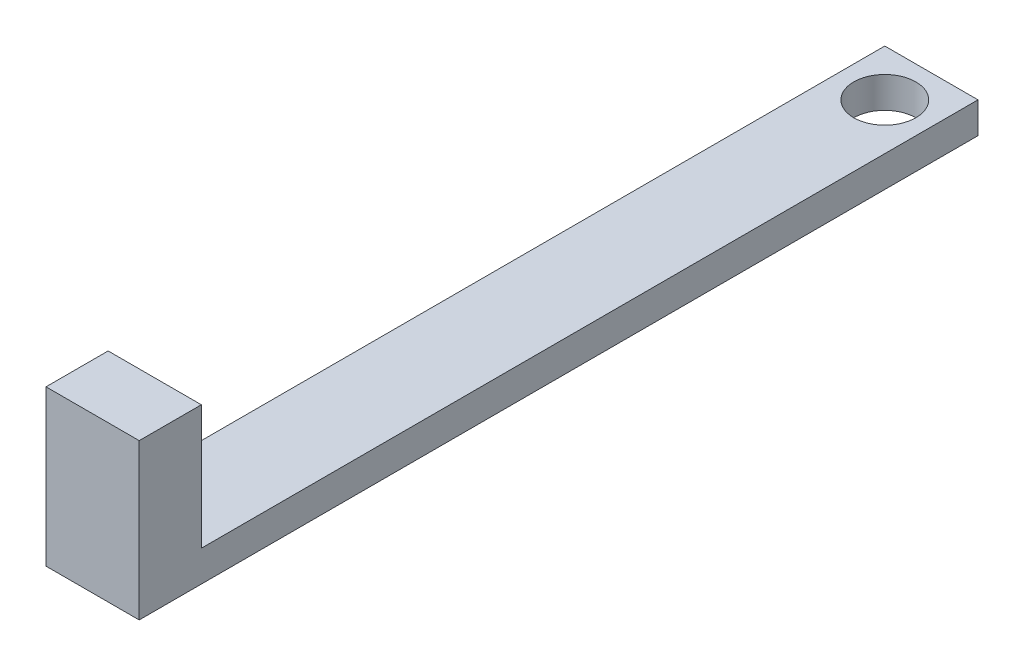
ISO-10303-21;
HEADER;
FILE_DESCRIPTION(('STEP AP214'),'2;1');
FILE_NAME('part.step','',(''),(''),'','','');
FILE_SCHEMA(('AUTOMOTIVE_DESIGN { 1 0 10303 214 1 1 1 1 }'));
ENDSEC;
DATA;
#1=APPLICATION_CONTEXT('core data for automotive mechanical design processes');
#2=APPLICATION_PROTOCOL_DEFINITION('international standard','automotive_design',2000,#1);
#3=PRODUCT_CONTEXT('',#1,'mechanical');
#4=PRODUCT('Part','Part','',(#3));
#5=PRODUCT_RELATED_PRODUCT_CATEGORY('part','',(#4));
#6=PRODUCT_DEFINITION_FORMATION('','',#4);
#7=PRODUCT_DEFINITION_CONTEXT('part definition',#1,'design');
#8=PRODUCT_DEFINITION('design','',#6,#7);
#9=PRODUCT_DEFINITION_SHAPE('','',#8);
#10=(LENGTH_UNIT() NAMED_UNIT(*) SI_UNIT(.MILLI.,.METRE.));
#11=(NAMED_UNIT(*) PLANE_ANGLE_UNIT() SI_UNIT($,.RADIAN.));
#12=(NAMED_UNIT(*) SI_UNIT($,.STERADIAN.) SOLID_ANGLE_UNIT());
#13=UNCERTAINTY_MEASURE_WITH_UNIT(LENGTH_MEASURE(1.E-05),#10,'distance_accuracy_value','');
#14=(GEOMETRIC_REPRESENTATION_CONTEXT(3) GLOBAL_UNCERTAINTY_ASSIGNED_CONTEXT((#13)) GLOBAL_UNIT_ASSIGNED_CONTEXT((#10,
#11,#12)) REPRESENTATION_CONTEXT('',''));
#15=CARTESIAN_POINT('',(0.,0.,0.));
#16=DIRECTION('',(0.,0.,1.));
#17=DIRECTION('',(1.,0.,0.));
#18=AXIS2_PLACEMENT_3D('',#15,#16,#17);
#19=CARTESIAN_POINT('',(30.,0.,0.));
#20=DIRECTION('',(0.,-1.,0.));
#21=DIRECTION('',(0.,0.,-1.));
#22=AXIS2_PLACEMENT_3D('',#19,#20,#21);
#23=PLANE('',#22);
#24=CARTESIAN_POINT('',(15.,0.,-235.));
#25=DIRECTION('',(0.,1.,0.));
#26=DIRECTION('',(0.,0.,1.));
#27=AXIS2_PLACEMENT_3D('',#24,#25,#26);
#28=CIRCLE('',#27,10.);
#29=CARTESIAN_POINT('',(15.,0.,-225.));
#30=VERTEX_POINT('',#29);
#31=EDGE_CURVE('E182',#30,#30,#28,.T.);
#32=ORIENTED_EDGE('',*,*,#31,.F.);
#33=EDGE_LOOP('',(#32));
#34=FACE_BOUND('',#33,.T.);
#35=DIRECTION('',(0.,0.,1.));
#36=VECTOR('',#35,1.);
#37=CARTESIAN_POINT('',(0.,0.,0.));
#38=LINE('',#37,#36);
#39=CARTESIAN_POINT('',(0.,0.,-250.));
#40=VERTEX_POINT('',#39);
#41=CARTESIAN_POINT('',(0.,0.,0.));
#42=VERTEX_POINT('',#41);
#43=EDGE_CURVE('E127',#40,#42,#38,.T.);
#44=ORIENTED_EDGE('',*,*,#43,.T.);
#45=DIRECTION('',(-1.,0.,0.));
#46=VECTOR('',#45,1.);
#47=CARTESIAN_POINT('',(30.,0.,0.));
#48=LINE('',#47,#46);
#49=CARTESIAN_POINT('',(30.,0.,0.));
#50=VERTEX_POINT('',#49);
#51=EDGE_CURVE('E11',#50,#42,#48,.T.);
#52=ORIENTED_EDGE('',*,*,#51,.F.);
#53=DIRECTION('',(0.,0.,1.));
#54=VECTOR('',#53,1.);
#55=CARTESIAN_POINT('',(30.,0.,0.));
#56=LINE('',#55,#54);
#57=CARTESIAN_POINT('',(30.,0.,-250.));
#58=VERTEX_POINT('',#57);
#59=EDGE_CURVE('E144',#58,#50,#56,.T.);
#60=ORIENTED_EDGE('',*,*,#59,.F.);
#61=DIRECTION('',(-1.,0.,0.));
#62=VECTOR('',#61,1.);
#63=CARTESIAN_POINT('',(30.,0.,-250.));
#64=LINE('',#63,#62);
#65=EDGE_CURVE('E123',#58,#40,#64,.T.);
#66=ORIENTED_EDGE('',*,*,#65,.T.);
#67=EDGE_LOOP('',(#44,#52,#60,#66));
#68=FACE_BOUND('',#67,.T.);
#69=ADVANCED_FACE('F38',(#34,#68),#23,.F.);
#70=CARTESIAN_POINT('',(30.,40.,0.));
#71=DIRECTION('',(0.,0.,1.));
#72=DIRECTION('',(0.,-1.,0.));
#73=AXIS2_PLACEMENT_3D('',#70,#71,#72);
#74=PLANE('',#73);
#75=DIRECTION('',(0.,1.,0.));
#76=VECTOR('',#75,1.);
#77=CARTESIAN_POINT('',(0.,40.,0.));
#78=LINE('',#77,#76);
#79=CARTESIAN_POINT('',(0.,40.,0.));
#80=VERTEX_POINT('',#79);
#81=EDGE_CURVE('E131',#42,#80,#78,.T.);
#82=ORIENTED_EDGE('',*,*,#81,.T.);
#83=DIRECTION('',(-1.,0.,0.));
#84=VECTOR('',#83,1.);
#85=CARTESIAN_POINT('',(30.,40.,0.));
#86=LINE('',#85,#84);
#87=CARTESIAN_POINT('',(30.,40.,0.));
#88=VERTEX_POINT('',#87);
#89=EDGE_CURVE('E47',#88,#80,#86,.T.);
#90=ORIENTED_EDGE('',*,*,#89,.F.);
#91=DIRECTION('',(0.,1.,0.));
#92=VECTOR('',#91,1.);
#93=CARTESIAN_POINT('',(30.,40.,0.));
#94=LINE('',#93,#92);
#95=EDGE_CURVE('E92',#50,#88,#94,.T.);
#96=ORIENTED_EDGE('',*,*,#95,.F.);
#97=ORIENTED_EDGE('',*,*,#51,.T.);
#98=EDGE_LOOP('',(#82,#90,#96,#97));
#99=FACE_BOUND('',#98,.T.);
#100=ADVANCED_FACE('F174',(#99),#74,.F.);
#101=CARTESIAN_POINT('',(30.,40.,20.));
#102=DIRECTION('',(0.,-1.,0.));
#103=DIRECTION('',(0.,0.,-1.));
#104=AXIS2_PLACEMENT_3D('',#101,#102,#103);
#105=PLANE('',#104);
#106=DIRECTION('',(0.,0.,1.));
#107=VECTOR('',#106,1.);
#108=CARTESIAN_POINT('',(0.,40.,20.));
#109=LINE('',#108,#107);
#110=CARTESIAN_POINT('',(0.,40.,20.));
#111=VERTEX_POINT('',#110);
#112=EDGE_CURVE('E135',#80,#111,#109,.T.);
#113=ORIENTED_EDGE('',*,*,#112,.T.);
#114=DIRECTION('',(-1.,0.,0.));
#115=VECTOR('',#114,1.);
#116=CARTESIAN_POINT('',(30.,40.,20.));
#117=LINE('',#116,#115);
#118=CARTESIAN_POINT('',(30.,40.,20.));
#119=VERTEX_POINT('',#118);
#120=EDGE_CURVE('E116',#119,#111,#117,.T.);
#121=ORIENTED_EDGE('',*,*,#120,.F.);
#122=DIRECTION('',(0.,0.,1.));
#123=VECTOR('',#122,1.);
#124=CARTESIAN_POINT('',(30.,40.,20.));
#125=LINE('',#124,#123);
#126=EDGE_CURVE('E105',#88,#119,#125,.T.);
#127=ORIENTED_EDGE('',*,*,#126,.F.);
#128=ORIENTED_EDGE('',*,*,#89,.T.);
#129=EDGE_LOOP('',(#113,#121,#127,#128));
#130=FACE_BOUND('',#129,.T.);
#131=ADVANCED_FACE('F154',(#130),#105,.F.);
#132=CARTESIAN_POINT('',(30.,-10.,20.));
#133=DIRECTION('',(0.,0.,-1.));
#134=DIRECTION('',(-1.,0.,0.));
#135=AXIS2_PLACEMENT_3D('',#132,#133,#134);
#136=PLANE('',#135);
#137=DIRECTION('',(0.,-1.,0.));
#138=VECTOR('',#137,1.);
#139=CARTESIAN_POINT('',(0.,-10.,20.));
#140=LINE('',#139,#138);
#141=CARTESIAN_POINT('',(0.,-10.,20.));
#142=VERTEX_POINT('',#141);
#143=EDGE_CURVE('E114',#111,#142,#140,.T.);
#144=ORIENTED_EDGE('',*,*,#143,.T.);
#145=DIRECTION('',(-1.,0.,0.));
#146=VECTOR('',#145,1.);
#147=CARTESIAN_POINT('',(30.,-10.,20.));
#148=LINE('',#147,#146);
#149=CARTESIAN_POINT('',(30.,-10.,20.));
#150=VERTEX_POINT('',#149);
#151=EDGE_CURVE('E111',#150,#142,#148,.T.);
#152=ORIENTED_EDGE('',*,*,#151,.F.);
#153=DIRECTION('',(0.,-1.,0.));
#154=VECTOR('',#153,1.);
#155=CARTESIAN_POINT('',(30.,-10.,20.));
#156=LINE('',#155,#154);
#157=EDGE_CURVE('E99',#119,#150,#156,.T.);
#158=ORIENTED_EDGE('',*,*,#157,.F.);
#159=ORIENTED_EDGE('',*,*,#120,.T.);
#160=EDGE_LOOP('',(#144,#152,#158,#159));
#161=FACE_BOUND('',#160,.T.);
#162=ADVANCED_FACE('F112',(#161),#136,.F.);
#163=CARTESIAN_POINT('',(30.,-10.,-250.));
#164=DIRECTION('',(0.,1.,0.));
#165=DIRECTION('',(0.,0.,1.));
#166=AXIS2_PLACEMENT_3D('',#163,#164,#165);
#167=PLANE('',#166);
#168=CARTESIAN_POINT('',(15.,-10.,-235.));
#169=DIRECTION('',(0.,1.,0.));
#170=DIRECTION('',(0.,0.,1.));
#171=AXIS2_PLACEMENT_3D('',#168,#169,#170);
#172=CIRCLE('',#171,10.);
#173=CARTESIAN_POINT('',(15.,-10.,-225.));
#174=VERTEX_POINT('',#173);
#175=EDGE_CURVE('E132',#174,#174,#172,.T.);
#176=ORIENTED_EDGE('',*,*,#175,.T.);
#177=EDGE_LOOP('',(#176));
#178=FACE_BOUND('',#177,.T.);
#179=DIRECTION('',(0.,0.,-1.));
#180=VECTOR('',#179,1.);
#181=CARTESIAN_POINT('',(0.,-10.,-250.));
#182=LINE('',#181,#180);
#183=CARTESIAN_POINT('',(0.,-10.,-250.));
#184=VERTEX_POINT('',#183);
#185=EDGE_CURVE('E78',#142,#184,#182,.T.);
#186=ORIENTED_EDGE('',*,*,#185,.T.);
#187=DIRECTION('',(-1.,0.,0.));
#188=VECTOR('',#187,1.);
#189=CARTESIAN_POINT('',(30.,-10.,-250.));
#190=LINE('',#189,#188);
#191=CARTESIAN_POINT('',(30.,-10.,-250.));
#192=VERTEX_POINT('',#191);
#193=EDGE_CURVE('E117',#192,#184,#190,.T.);
#194=ORIENTED_EDGE('',*,*,#193,.F.);
#195=DIRECTION('',(0.,0.,-1.));
#196=VECTOR('',#195,1.);
#197=CARTESIAN_POINT('',(30.,-10.,-250.));
#198=LINE('',#197,#196);
#199=EDGE_CURVE('E103',#150,#192,#198,.T.);
#200=ORIENTED_EDGE('',*,*,#199,.F.);
#201=ORIENTED_EDGE('',*,*,#151,.T.);
#202=EDGE_LOOP('',(#186,#194,#200,#201));
#203=FACE_BOUND('',#202,.T.);
#204=ADVANCED_FACE('F119',(#178,#203),#167,.F.);
#205=CARTESIAN_POINT('',(30.,0.,-250.));
#206=DIRECTION('',(0.,0.,1.));
#207=DIRECTION('',(1.,0.,0.));
#208=AXIS2_PLACEMENT_3D('',#205,#206,#207);
#209=PLANE('',#208);
#210=DIRECTION('',(0.,1.,0.));
#211=VECTOR('',#210,1.);
#212=CARTESIAN_POINT('',(0.,0.,-250.));
#213=LINE('',#212,#211);
#214=EDGE_CURVE('E84',#184,#40,#213,.T.);
#215=ORIENTED_EDGE('',*,*,#214,.T.);
#216=ORIENTED_EDGE('',*,*,#65,.F.);
#217=DIRECTION('',(0.,1.,0.));
#218=VECTOR('',#217,1.);
#219=CARTESIAN_POINT('',(30.,0.,-250.));
#220=LINE('',#219,#218);
#221=EDGE_CURVE('E55',#192,#58,#220,.T.);
#222=ORIENTED_EDGE('',*,*,#221,.F.);
#223=ORIENTED_EDGE('',*,*,#193,.T.);
#224=EDGE_LOOP('',(#215,#216,#222,#223));
#225=FACE_BOUND('',#224,.T.);
#226=ADVANCED_FACE('F161',(#225),#209,.F.);
#227=CARTESIAN_POINT('',(30.,0.,0.));
#228=DIRECTION('',(-1.,0.,0.));
#229=DIRECTION('',(0.,0.,1.));
#230=AXIS2_PLACEMENT_3D('',#227,#228,#229);
#231=PLANE('',#230);
#232=ORIENTED_EDGE('',*,*,#59,.T.);
#233=ORIENTED_EDGE('',*,*,#95,.T.);
#234=ORIENTED_EDGE('',*,*,#126,.T.);
#235=ORIENTED_EDGE('',*,*,#157,.T.);
#236=ORIENTED_EDGE('',*,*,#199,.T.);
#237=ORIENTED_EDGE('',*,*,#221,.T.);
#238=EDGE_LOOP('',(#232,#233,#234,#235,#236,#237));
#239=FACE_BOUND('',#238,.T.);
#240=ADVANCED_FACE('F101',(#239),#231,.F.);
#241=CARTESIAN_POINT('',(0.,0.,0.));
#242=DIRECTION('',(-1.,0.,0.));
#243=DIRECTION('',(0.,0.,1.));
#244=AXIS2_PLACEMENT_3D('',#241,#242,#243);
#245=PLANE('',#244);
#246=ORIENTED_EDGE('',*,*,#43,.F.);
#247=ORIENTED_EDGE('',*,*,#214,.F.);
#248=ORIENTED_EDGE('',*,*,#185,.F.);
#249=ORIENTED_EDGE('',*,*,#143,.F.);
#250=ORIENTED_EDGE('',*,*,#112,.F.);
#251=ORIENTED_EDGE('',*,*,#81,.F.);
#252=EDGE_LOOP('',(#246,#247,#248,#249,#250,#251));
#253=FACE_BOUND('',#252,.T.);
#254=ADVANCED_FACE('F157',(#253),#245,.T.);
#255=CARTESIAN_POINT('',(15.,-10.,-235.));
#256=DIRECTION('',(0.,1.,0.));
#257=DIRECTION('',(0.,0.,1.));
#258=AXIS2_PLACEMENT_3D('',#255,#256,#257);
#259=CYLINDRICAL_SURFACE('',#258,10.);
#260=ORIENTED_EDGE('',*,*,#175,.F.);
#261=EDGE_LOOP('',(#260));
#262=FACE_BOUND('',#261,.T.);
#263=ORIENTED_EDGE('',*,*,#31,.T.);
#264=EDGE_LOOP('',(#263));
#265=FACE_BOUND('',#264,.T.);
#266=ADVANCED_FACE('F196',(#262,#265),#259,.F.);
#267=CLOSED_SHELL('',(#69,#100,#131,#162,#204,#226,#240,#254,#266));
#268=MANIFOLD_SOLID_BREP('B2',#267);
#269=ADVANCED_BREP_SHAPE_REPRESENTATION('',(#18,#268),#14);
#270=SHAPE_DEFINITION_REPRESENTATION(#9,#269);
ENDSEC;
END-ISO-10303-21;
